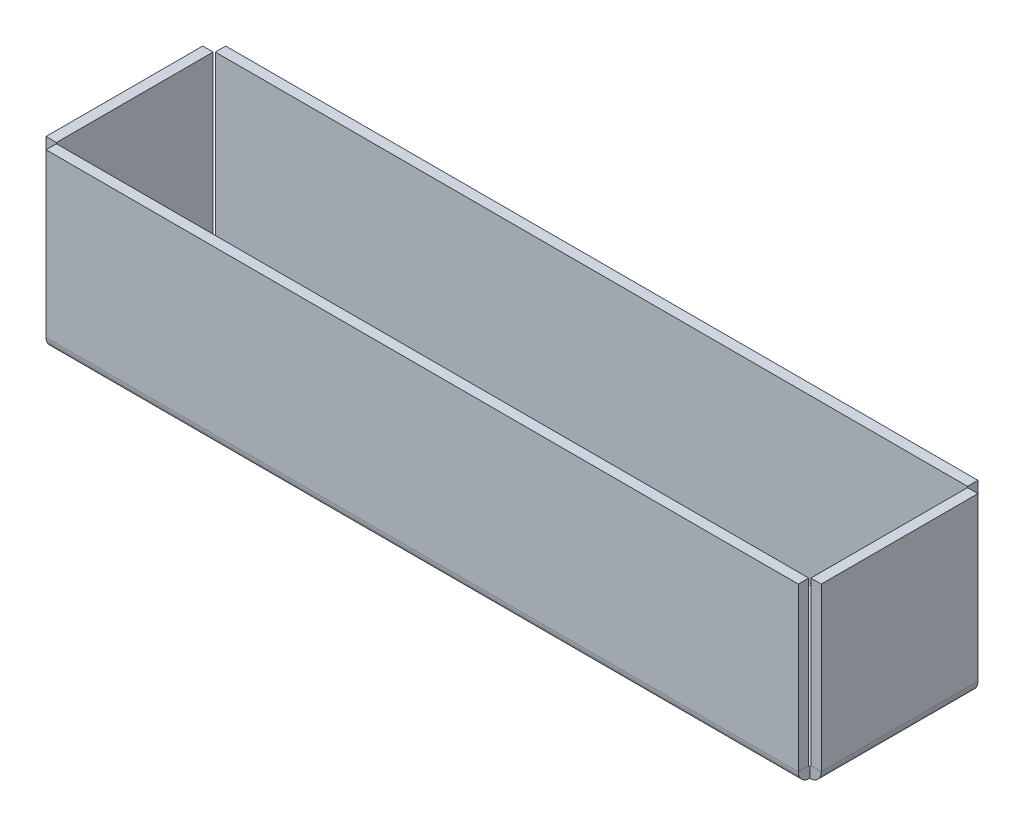
ISO-10303-21;
HEADER;
FILE_DESCRIPTION(('STEP AP214'),'2;1');
FILE_NAME('part.step','',(''),(''),'','','');
FILE_SCHEMA(('AUTOMOTIVE_DESIGN { 1 0 10303 214 1 1 1 1 }'));
ENDSEC;
DATA;
#1=APPLICATION_CONTEXT('core data for automotive mechanical design processes');
#2=APPLICATION_PROTOCOL_DEFINITION('international standard','automotive_design',2000,#1);
#3=PRODUCT_CONTEXT('',#1,'mechanical');
#4=PRODUCT('Part','Part','',(#3));
#5=PRODUCT_RELATED_PRODUCT_CATEGORY('part','',(#4));
#6=PRODUCT_DEFINITION_FORMATION('','',#4);
#7=PRODUCT_DEFINITION_CONTEXT('part definition',#1,'design');
#8=PRODUCT_DEFINITION('design','',#6,#7);
#9=PRODUCT_DEFINITION_SHAPE('','',#8);
#10=(LENGTH_UNIT() NAMED_UNIT(*) SI_UNIT(.MILLI.,.METRE.));
#11=(NAMED_UNIT(*) PLANE_ANGLE_UNIT() SI_UNIT($,.RADIAN.));
#12=(NAMED_UNIT(*) SI_UNIT($,.STERADIAN.) SOLID_ANGLE_UNIT());
#13=UNCERTAINTY_MEASURE_WITH_UNIT(LENGTH_MEASURE(1.E-05),#10,'distance_accuracy_value','');
#14=(GEOMETRIC_REPRESENTATION_CONTEXT(3) GLOBAL_UNCERTAINTY_ASSIGNED_CONTEXT((#13)) GLOBAL_UNIT_ASSIGNED_CONTEXT((#10,
#11,#12)) REPRESENTATION_CONTEXT('',''));
#15=CARTESIAN_POINT('',(0.,0.,0.));
#16=DIRECTION('',(0.,0.,1.));
#17=DIRECTION('',(1.,0.,0.));
#18=AXIS2_PLACEMENT_3D('',#15,#16,#17);
#19=CARTESIAN_POINT('',(0.,0.,0.));
#20=DIRECTION('',(0.,-1.,0.));
#21=DIRECTION('',(0.,0.,-1.));
#22=AXIS2_PLACEMENT_3D('',#19,#20,#21);
#23=PLANE('',#22);
#24=DIRECTION('',(0.,0.,1.));
#25=VECTOR('',#24,1.);
#26=CARTESIAN_POINT('',(36.,0.,0.));
#27=LINE('',#26,#25);
#28=CARTESIAN_POINT('',(36.,0.,-7.5));
#29=VERTEX_POINT('',#28);
#30=CARTESIAN_POINT('',(36.,0.,7.5));
#31=VERTEX_POINT('',#30);
#32=EDGE_CURVE('E375',#29,#31,#27,.T.);
#33=ORIENTED_EDGE('',*,*,#32,.F.);
#34=DIRECTION('',(-1.,0.,0.));
#35=VECTOR('',#34,1.);
#36=CARTESIAN_POINT('',(0.,0.,-7.5));
#37=LINE('',#36,#35);
#38=CARTESIAN_POINT('',(-36.,0.,-7.49999999999999));
#39=VERTEX_POINT('',#38);
#40=EDGE_CURVE('E60',#29,#39,#37,.T.);
#41=ORIENTED_EDGE('',*,*,#40,.T.);
#42=DIRECTION('',(0.,0.,1.));
#43=VECTOR('',#42,1.);
#44=CARTESIAN_POINT('',(-36.,0.,0.));
#45=LINE('',#44,#43);
#46=CARTESIAN_POINT('',(-36.,0.,7.5));
#47=VERTEX_POINT('',#46);
#48=EDGE_CURVE('E336',#39,#47,#45,.T.);
#49=ORIENTED_EDGE('',*,*,#48,.T.);
#50=DIRECTION('',(1.,0.,0.));
#51=VECTOR('',#50,1.);
#52=CARTESIAN_POINT('',(0.,0.,7.5));
#53=LINE('',#52,#51);
#54=EDGE_CURVE('E382',#47,#31,#53,.T.);
#55=ORIENTED_EDGE('',*,*,#54,.T.);
#56=EDGE_LOOP('',(#33,#41,#49,#55));
#57=FACE_BOUND('',#56,.T.);
#58=ADVANCED_FACE('F53',(#57),#23,.F.);
#59=CARTESIAN_POINT('',(0.,-1.,0.));
#60=DIRECTION('',(0.,-1.,0.));
#61=DIRECTION('',(0.,0.,-1.));
#62=AXIS2_PLACEMENT_3D('',#59,#60,#61);
#63=PLANE('',#62);
#64=DIRECTION('',(-1.,0.,0.));
#65=VECTOR('',#64,1.);
#66=CARTESIAN_POINT('',(0.,-1.,-7.5));
#67=LINE('',#66,#65);
#68=CARTESIAN_POINT('',(36.,-1.,-7.5));
#69=VERTEX_POINT('',#68);
#70=CARTESIAN_POINT('',(-36.,-1.,-7.50000000000001));
#71=VERTEX_POINT('',#70);
#72=EDGE_CURVE('E388',#69,#71,#67,.T.);
#73=ORIENTED_EDGE('',*,*,#72,.F.);
#74=DIRECTION('',(0.,0.,1.));
#75=VECTOR('',#74,1.);
#76=CARTESIAN_POINT('',(36.,-1.,0.));
#77=LINE('',#76,#75);
#78=CARTESIAN_POINT('',(36.,-1.,7.5));
#79=VERTEX_POINT('',#78);
#80=EDGE_CURVE('E366',#69,#79,#77,.T.);
#81=ORIENTED_EDGE('',*,*,#80,.T.);
#82=DIRECTION('',(1.,0.,0.));
#83=VECTOR('',#82,1.);
#84=CARTESIAN_POINT('',(0.,-1.,7.5));
#85=LINE('',#84,#83);
#86=CARTESIAN_POINT('',(-36.,-1.,7.5));
#87=VERTEX_POINT('',#86);
#88=EDGE_CURVE('E378',#87,#79,#85,.T.);
#89=ORIENTED_EDGE('',*,*,#88,.F.);
#90=DIRECTION('',(0.,0.,1.));
#91=VECTOR('',#90,1.);
#92=CARTESIAN_POINT('',(-36.,-1.,0.));
#93=LINE('',#92,#91);
#94=EDGE_CURVE('E331',#71,#87,#93,.T.);
#95=ORIENTED_EDGE('',*,*,#94,.F.);
#96=EDGE_LOOP('',(#73,#81,#89,#95));
#97=FACE_BOUND('',#96,.T.);
#98=ADVANCED_FACE('F424',(#97),#63,.T.);
#99=CARTESIAN_POINT('',(-37.1000000000001,-36.8424777960769,0.));
#100=DIRECTION('',(-1.,0.,0.));
#101=DIRECTION('',(0.,0.,-1.));
#102=AXIS2_PLACEMENT_3D('',#99,#100,#101);
#103=PLANE('',#102);
#104=DIRECTION('',(0.,-1.,0.));
#105=VECTOR('',#104,1.);
#106=CARTESIAN_POINT('',(-37.0999999999999,15.6575222039231,-7.5));
#107=LINE('',#106,#105);
#108=CARTESIAN_POINT('',(-37.0999999999999,15.6575222039231,-7.5));
#109=VERTEX_POINT('',#108);
#110=CARTESIAN_POINT('',(-37.1,0.0999999999999992,-7.5));
#111=VERTEX_POINT('',#110);
#112=EDGE_CURVE('E350',#109,#111,#107,.T.);
#113=ORIENTED_EDGE('',*,*,#112,.T.);
#114=DIRECTION('',(0.,0.,1.));
#115=VECTOR('',#114,1.);
#116=CARTESIAN_POINT('',(-37.1,0.100000000000003,0.));
#117=LINE('',#116,#115);
#118=CARTESIAN_POINT('',(-37.1,0.100000000000003,7.5));
#119=VERTEX_POINT('',#118);
#120=EDGE_CURVE('E354',#111,#119,#117,.T.);
#121=ORIENTED_EDGE('',*,*,#120,.T.);
#122=DIRECTION('',(0.,1.,0.));
#123=VECTOR('',#122,1.);
#124=CARTESIAN_POINT('',(-37.0999999999999,15.6575222039231,7.5));
#125=LINE('',#124,#123);
#126=CARTESIAN_POINT('',(-37.0999999999999,15.6575222039231,7.5));
#127=VERTEX_POINT('',#126);
#128=EDGE_CURVE('E346',#119,#127,#125,.T.);
#129=ORIENTED_EDGE('',*,*,#128,.T.);
#130=DIRECTION('',(0.,0.,1.));
#131=VECTOR('',#130,1.);
#132=CARTESIAN_POINT('',(-37.0999999999999,15.6575222039231,24.));
#133=LINE('',#132,#131);
#134=EDGE_CURVE('E351',#109,#127,#133,.T.);
#135=ORIENTED_EDGE('',*,*,#134,.F.);
#136=EDGE_LOOP('',(#113,#121,#129,#135));
#137=FACE_BOUND('',#136,.T.);
#138=ADVANCED_FACE('F430',(#137),#103,.T.);
#139=CARTESIAN_POINT('',(-37.0999999999999,15.6575222039231,24.));
#140=DIRECTION('',(0.,1.,0.));
#141=DIRECTION('',(0.,0.,1.));
#142=AXIS2_PLACEMENT_3D('',#139,#140,#141);
#143=PLANE('',#142);
#144=DIRECTION('',(1.,0.,0.));
#145=VECTOR('',#144,1.);
#146=CARTESIAN_POINT('',(-37.0999999999999,15.6575222039231,7.5));
#147=LINE('',#146,#145);
#148=CARTESIAN_POINT('',(-36.1,15.6575222039231,7.5));
#149=VERTEX_POINT('',#148);
#150=EDGE_CURVE('E342',#127,#149,#147,.T.);
#151=ORIENTED_EDGE('',*,*,#150,.T.);
#152=DIRECTION('',(0.,0.,1.));
#153=VECTOR('',#152,1.);
#154=CARTESIAN_POINT('',(-36.1,15.6575222039231,24.));
#155=LINE('',#154,#153);
#156=CARTESIAN_POINT('',(-36.1,15.6575222039231,-7.5));
#157=VERTEX_POINT('',#156);
#158=EDGE_CURVE('E349',#157,#149,#155,.T.);
#159=ORIENTED_EDGE('',*,*,#158,.F.);
#160=DIRECTION('',(1.,0.,0.));
#161=VECTOR('',#160,1.);
#162=CARTESIAN_POINT('',(-37.0999999999999,15.6575222039231,-7.5));
#163=LINE('',#162,#161);
#164=EDGE_CURVE('E347',#109,#157,#163,.T.);
#165=ORIENTED_EDGE('',*,*,#164,.F.);
#166=ORIENTED_EDGE('',*,*,#134,.T.);
#167=EDGE_LOOP('',(#151,#159,#165,#166));
#168=FACE_BOUND('',#167,.T.);
#169=ADVANCED_FACE('F444',(#168),#143,.T.);
#170=CARTESIAN_POINT('',(-36.1000000000001,-36.8424777960769,0.));
#171=DIRECTION('',(-1.,0.,0.));
#172=DIRECTION('',(0.,0.,-1.));
#173=AXIS2_PLACEMENT_3D('',#170,#171,#172);
#174=PLANE('',#173);
#175=DIRECTION('',(0.,0.,1.));
#176=VECTOR('',#175,1.);
#177=CARTESIAN_POINT('',(-36.1,0.0999999999999959,0.));
#178=LINE('',#177,#176);
#179=CARTESIAN_POINT('',(-36.1,0.1,-7.5));
#180=VERTEX_POINT('',#179);
#181=CARTESIAN_POINT('',(-36.1,0.1,7.5));
#182=VERTEX_POINT('',#181);
#183=EDGE_CURVE('E361',#180,#182,#178,.T.);
#184=ORIENTED_EDGE('',*,*,#183,.F.);
#185=DIRECTION('',(0.,-1.,0.));
#186=VECTOR('',#185,1.);
#187=CARTESIAN_POINT('',(-36.1,15.6575222039231,-7.5));
#188=LINE('',#187,#186);
#189=EDGE_CURVE('E345',#157,#180,#188,.T.);
#190=ORIENTED_EDGE('',*,*,#189,.F.);
#191=ORIENTED_EDGE('',*,*,#158,.T.);
#192=DIRECTION('',(0.,1.,0.));
#193=VECTOR('',#192,1.);
#194=CARTESIAN_POINT('',(-36.1,15.6575222039231,7.5));
#195=LINE('',#194,#193);
#196=EDGE_CURVE('E339',#182,#149,#195,.T.);
#197=ORIENTED_EDGE('',*,*,#196,.F.);
#198=EDGE_LOOP('',(#184,#190,#191,#197));
#199=FACE_BOUND('',#198,.T.);
#200=ADVANCED_FACE('F438',(#199),#174,.F.);
#201=CARTESIAN_POINT('',(-37.0999999999999,15.6575222039231,-7.5));
#202=DIRECTION('',(0.,0.,1.));
#203=DIRECTION('',(0.,-1.,0.));
#204=AXIS2_PLACEMENT_3D('',#201,#202,#203);
#205=PLANE('',#204);
#206=DIRECTION('',(1.,0.,0.));
#207=VECTOR('',#206,1.);
#208=CARTESIAN_POINT('',(-37.1,0.100000000000003,-7.5));
#209=LINE('',#208,#207);
#210=EDGE_CURVE('E359',#111,#180,#209,.T.);
#211=ORIENTED_EDGE('',*,*,#210,.F.);
#212=ORIENTED_EDGE('',*,*,#112,.F.);
#213=ORIENTED_EDGE('',*,*,#164,.T.);
#214=ORIENTED_EDGE('',*,*,#189,.T.);
#215=EDGE_LOOP('',(#211,#212,#213,#214));
#216=FACE_BOUND('',#215,.T.);
#217=ADVANCED_FACE('F434',(#216),#205,.F.);
#218=CARTESIAN_POINT('',(-37.0999999999999,15.6575222039231,7.5));
#219=DIRECTION('',(0.,0.,-1.));
#220=DIRECTION('',(0.,1.,0.));
#221=AXIS2_PLACEMENT_3D('',#218,#219,#220);
#222=PLANE('',#221);
#223=DIRECTION('',(-1.,0.,0.));
#224=VECTOR('',#223,1.);
#225=CARTESIAN_POINT('',(-37.1,0.100000000000003,7.5));
#226=LINE('',#225,#224);
#227=EDGE_CURVE('E363',#182,#119,#226,.T.);
#228=ORIENTED_EDGE('',*,*,#227,.F.);
#229=ORIENTED_EDGE('',*,*,#196,.T.);
#230=ORIENTED_EDGE('',*,*,#150,.F.);
#231=ORIENTED_EDGE('',*,*,#128,.F.);
#232=EDGE_LOOP('',(#228,#229,#230,#231));
#233=FACE_BOUND('',#232,.T.);
#234=ADVANCED_FACE('F442',(#233),#222,.F.);
#235=CARTESIAN_POINT('',(-36.,0.1,-7.5));
#236=DIRECTION('',(0.,0.,-1.));
#237=DIRECTION('',(-1.,0.,0.));
#238=AXIS2_PLACEMENT_3D('',#235,#236,#237);
#239=PLANE('',#238);
#240=ORIENTED_EDGE('',*,*,#210,.T.);
#241=CARTESIAN_POINT('',(-36.,0.1,-7.5));
#242=DIRECTION('',(0.,0.,-1.));
#243=DIRECTION('',(-1.,0.,0.));
#244=AXIS2_PLACEMENT_3D('',#241,#242,#243);
#245=CIRCLE('',#244,0.1);
#246=EDGE_CURVE('E320',#180,#39,#245,.F.);
#247=ORIENTED_EDGE('',*,*,#246,.T.);
#248=DIRECTION('',(0.,1.,0.));
#249=VECTOR('',#248,1.);
#250=CARTESIAN_POINT('',(-36.,-1.,-7.5));
#251=LINE('',#250,#249);
#252=EDGE_CURVE('E390',#71,#39,#251,.T.);
#253=ORIENTED_EDGE('',*,*,#252,.F.);
#254=CARTESIAN_POINT('',(-36.,0.1,-7.5));
#255=DIRECTION('',(0.,0.,1.));
#256=DIRECTION('',(1.,0.,0.));
#257=AXIS2_PLACEMENT_3D('',#254,#255,#256);
#258=CIRCLE('',#257,1.1);
#259=EDGE_CURVE('E325',#111,#71,#258,.T.);
#260=ORIENTED_EDGE('',*,*,#259,.F.);
#261=EDGE_LOOP('',(#240,#247,#253,#260));
#262=FACE_BOUND('',#261,.T.);
#263=ADVANCED_FACE('F404',(#262),#239,.T.);
#264=CARTESIAN_POINT('',(-36.,0.1,7.5));
#265=DIRECTION('',(0.,0.,1.));
#266=DIRECTION('',(1.,0.,0.));
#267=AXIS2_PLACEMENT_3D('',#264,#265,#266);
#268=PLANE('',#267);
#269=CARTESIAN_POINT('',(-36.,0.1,7.5));
#270=DIRECTION('',(0.,0.,-1.));
#271=DIRECTION('',(-1.,0.,0.));
#272=AXIS2_PLACEMENT_3D('',#269,#270,#271);
#273=CIRCLE('',#272,0.1);
#274=EDGE_CURVE('E329',#47,#182,#273,.T.);
#275=ORIENTED_EDGE('',*,*,#274,.T.);
#276=ORIENTED_EDGE('',*,*,#227,.T.);
#277=CARTESIAN_POINT('',(-36.,0.1,7.5));
#278=DIRECTION('',(0.,0.,-1.));
#279=DIRECTION('',(-1.,0.,0.));
#280=AXIS2_PLACEMENT_3D('',#277,#278,#279);
#281=CIRCLE('',#280,1.1);
#282=EDGE_CURVE('E328',#87,#119,#281,.T.);
#283=ORIENTED_EDGE('',*,*,#282,.F.);
#284=DIRECTION('',(0.,1.,0.));
#285=VECTOR('',#284,1.);
#286=CARTESIAN_POINT('',(-36.,-1.,7.5));
#287=LINE('',#286,#285);
#288=EDGE_CURVE('E385',#87,#47,#287,.T.);
#289=ORIENTED_EDGE('',*,*,#288,.T.);
#290=EDGE_LOOP('',(#275,#276,#283,#289));
#291=FACE_BOUND('',#290,.T.);
#292=ADVANCED_FACE('F413',(#291),#268,.T.);
#293=CARTESIAN_POINT('',(-36.,0.1,15.0628106406506));
#294=DIRECTION('',(0.,0.,-1.));
#295=DIRECTION('',(-1.,0.,0.));
#296=AXIS2_PLACEMENT_3D('',#293,#294,#295);
#297=CYLINDRICAL_SURFACE('',#296,1.1);
#298=ORIENTED_EDGE('',*,*,#94,.T.);
#299=ORIENTED_EDGE('',*,*,#282,.T.);
#300=ORIENTED_EDGE('',*,*,#120,.F.);
#301=ORIENTED_EDGE('',*,*,#259,.T.);
#302=EDGE_LOOP('',(#298,#299,#300,#301));
#303=FACE_BOUND('',#302,.T.);
#304=ADVANCED_FACE('F427',(#303),#297,.T.);
#305=CARTESIAN_POINT('',(-36.,0.1,15.0628106406506));
#306=DIRECTION('',(0.,0.,-1.));
#307=DIRECTION('',(-1.,0.,0.));
#308=AXIS2_PLACEMENT_3D('',#305,#306,#307);
#309=CYLINDRICAL_SURFACE('',#308,0.1);
#310=ORIENTED_EDGE('',*,*,#48,.F.);
#311=ORIENTED_EDGE('',*,*,#246,.F.);
#312=ORIENTED_EDGE('',*,*,#183,.T.);
#313=ORIENTED_EDGE('',*,*,#274,.F.);
#314=EDGE_LOOP('',(#310,#311,#312,#313));
#315=FACE_BOUND('',#314,.T.);
#316=ADVANCED_FACE('F408',(#315),#309,.F.);
#317=CARTESIAN_POINT('',(36.,0.1,-7.5));
#318=DIRECTION('',(0.,0.,-1.));
#319=DIRECTION('',(-1.,0.,0.));
#320=AXIS2_PLACEMENT_3D('',#317,#318,#319);
#321=PLANE('',#320);
#322=DIRECTION('',(0.,1.,0.));
#323=VECTOR('',#322,1.);
#324=CARTESIAN_POINT('',(36.,-1.,-7.5));
#325=LINE('',#324,#323);
#326=EDGE_CURVE('E12',#69,#29,#325,.T.);
#327=ORIENTED_EDGE('',*,*,#326,.T.);
#328=CARTESIAN_POINT('',(36.,0.1,-7.5));
#329=DIRECTION('',(0.,0.,1.));
#330=DIRECTION('',(1.,0.,0.));
#331=AXIS2_PLACEMENT_3D('',#328,#329,#330);
#332=CIRCLE('',#331,0.1);
#333=CARTESIAN_POINT('',(36.1,0.0999999999999959,-7.5));
#334=VERTEX_POINT('',#333);
#335=EDGE_CURVE('E284',#29,#334,#332,.T.);
#336=ORIENTED_EDGE('',*,*,#335,.T.);
#337=DIRECTION('',(-1.,0.,0.));
#338=VECTOR('',#337,1.);
#339=CARTESIAN_POINT('',(37.1,0.100000000000003,-7.5));
#340=LINE('',#339,#338);
#341=CARTESIAN_POINT('',(37.1,0.100000000000003,-7.5));
#342=VERTEX_POINT('',#341);
#343=EDGE_CURVE('E297',#342,#334,#340,.T.);
#344=ORIENTED_EDGE('',*,*,#343,.F.);
#345=CARTESIAN_POINT('',(36.,0.1,-7.5));
#346=DIRECTION('',(0.,0.,1.));
#347=DIRECTION('',(1.,0.,0.));
#348=AXIS2_PLACEMENT_3D('',#345,#346,#347);
#349=CIRCLE('',#348,1.1);
#350=EDGE_CURVE('E313',#69,#342,#349,.T.);
#351=ORIENTED_EDGE('',*,*,#350,.F.);
#352=EDGE_LOOP('',(#327,#336,#344,#351));
#353=FACE_BOUND('',#352,.T.);
#354=ADVANCED_FACE('F498',(#353),#321,.T.);
#355=CARTESIAN_POINT('',(36.,0.1,7.5));
#356=DIRECTION('',(0.,0.,1.));
#357=DIRECTION('',(1.,0.,0.));
#358=AXIS2_PLACEMENT_3D('',#355,#356,#357);
#359=PLANE('',#358);
#360=DIRECTION('',(1.,0.,0.));
#361=VECTOR('',#360,1.);
#362=CARTESIAN_POINT('',(37.1,0.100000000000003,7.5));
#363=LINE('',#362,#361);
#364=CARTESIAN_POINT('',(36.1,0.0999999999999959,7.5));
#365=VERTEX_POINT('',#364);
#366=CARTESIAN_POINT('',(37.1,0.0999999999999992,7.5));
#367=VERTEX_POINT('',#366);
#368=EDGE_CURVE('E285',#365,#367,#363,.T.);
#369=ORIENTED_EDGE('',*,*,#368,.F.);
#370=CARTESIAN_POINT('',(36.,0.1,7.5));
#371=DIRECTION('',(0.,0.,1.));
#372=DIRECTION('',(1.,0.,0.));
#373=AXIS2_PLACEMENT_3D('',#370,#371,#372);
#374=CIRCLE('',#373,0.1);
#375=EDGE_CURVE('E317',#365,#31,#374,.F.);
#376=ORIENTED_EDGE('',*,*,#375,.T.);
#377=DIRECTION('',(0.,1.,0.));
#378=VECTOR('',#377,1.);
#379=CARTESIAN_POINT('',(36.,-1.,7.5));
#380=LINE('',#379,#378);
#381=EDGE_CURVE('E380',#79,#31,#380,.T.);
#382=ORIENTED_EDGE('',*,*,#381,.F.);
#383=CARTESIAN_POINT('',(36.,0.1,7.5));
#384=DIRECTION('',(0.,0.,-1.));
#385=DIRECTION('',(-1.,0.,0.));
#386=AXIS2_PLACEMENT_3D('',#383,#384,#385);
#387=CIRCLE('',#386,1.1);
#388=EDGE_CURVE('E316',#367,#79,#387,.T.);
#389=ORIENTED_EDGE('',*,*,#388,.F.);
#390=EDGE_LOOP('',(#369,#376,#382,#389));
#391=FACE_BOUND('',#390,.T.);
#392=ADVANCED_FACE('F505',(#391),#359,.T.);
#393=CARTESIAN_POINT('',(36.,0.1,-15.0628106406506));
#394=DIRECTION('',(0.,0.,1.));
#395=DIRECTION('',(1.,0.,0.));
#396=AXIS2_PLACEMENT_3D('',#393,#394,#395);
#397=CYLINDRICAL_SURFACE('',#396,1.1);
#398=ORIENTED_EDGE('',*,*,#388,.T.);
#399=ORIENTED_EDGE('',*,*,#80,.F.);
#400=ORIENTED_EDGE('',*,*,#350,.T.);
#401=DIRECTION('',(0.,0.,1.));
#402=VECTOR('',#401,1.);
#403=CARTESIAN_POINT('',(37.1,0.100000000000003,0.));
#404=LINE('',#403,#402);
#405=EDGE_CURVE('E278',#342,#367,#404,.T.);
#406=ORIENTED_EDGE('',*,*,#405,.T.);
#407=EDGE_LOOP('',(#398,#399,#400,#406));
#408=FACE_BOUND('',#407,.T.);
#409=ADVANCED_FACE('F513',(#408),#397,.T.);
#410=CARTESIAN_POINT('',(36.,0.1,-15.0628106406506));
#411=DIRECTION('',(0.,0.,1.));
#412=DIRECTION('',(1.,0.,0.));
#413=AXIS2_PLACEMENT_3D('',#410,#411,#412);
#414=CYLINDRICAL_SURFACE('',#413,0.1);
#415=ORIENTED_EDGE('',*,*,#375,.F.);
#416=DIRECTION('',(0.,0.,1.));
#417=VECTOR('',#416,1.);
#418=CARTESIAN_POINT('',(36.1,0.0999999999999959,0.));
#419=LINE('',#418,#417);
#420=EDGE_CURVE('E292',#334,#365,#419,.T.);
#421=ORIENTED_EDGE('',*,*,#420,.F.);
#422=ORIENTED_EDGE('',*,*,#335,.F.);
#423=ORIENTED_EDGE('',*,*,#32,.T.);
#424=EDGE_LOOP('',(#415,#421,#422,#423));
#425=FACE_BOUND('',#424,.T.);
#426=ADVANCED_FACE('F521',(#425),#414,.F.);
#427=CARTESIAN_POINT('',(37.0999999999999,15.6575222039231,24.));
#428=DIRECTION('',(0.,1.,0.));
#429=DIRECTION('',(0.,0.,-1.));
#430=AXIS2_PLACEMENT_3D('',#427,#428,#429);
#431=PLANE('',#430);
#432=DIRECTION('',(-1.,0.,0.));
#433=VECTOR('',#432,1.);
#434=CARTESIAN_POINT('',(37.0999999999999,15.6575222039231,7.5));
#435=LINE('',#434,#433);
#436=CARTESIAN_POINT('',(37.0999999999999,15.6575222039231,7.5));
#437=VERTEX_POINT('',#436);
#438=CARTESIAN_POINT('',(36.0999999999999,15.6575222039231,7.5));
#439=VERTEX_POINT('',#438);
#440=EDGE_CURVE('E282',#437,#439,#435,.T.);
#441=ORIENTED_EDGE('',*,*,#440,.F.);
#442=DIRECTION('',(0.,0.,-1.));
#443=VECTOR('',#442,1.);
#444=CARTESIAN_POINT('',(37.0999999999999,15.6575222039231,24.));
#445=LINE('',#444,#443);
#446=CARTESIAN_POINT('',(37.0999999999999,15.6575222039231,-7.5));
#447=VERTEX_POINT('',#446);
#448=EDGE_CURVE('E308',#437,#447,#445,.T.);
#449=ORIENTED_EDGE('',*,*,#448,.T.);
#450=DIRECTION('',(-1.,0.,0.));
#451=VECTOR('',#450,1.);
#452=CARTESIAN_POINT('',(37.0999999999999,15.6575222039231,-7.5));
#453=LINE('',#452,#451);
#454=CARTESIAN_POINT('',(36.0999999999999,15.6575222039231,-7.5));
#455=VERTEX_POINT('',#454);
#456=EDGE_CURVE('E305',#447,#455,#453,.T.);
#457=ORIENTED_EDGE('',*,*,#456,.T.);
#458=DIRECTION('',(0.,0.,-1.));
#459=VECTOR('',#458,1.);
#460=CARTESIAN_POINT('',(36.0999999999999,15.6575222039231,24.));
#461=LINE('',#460,#459);
#462=EDGE_CURVE('E289',#439,#455,#461,.T.);
#463=ORIENTED_EDGE('',*,*,#462,.F.);
#464=EDGE_LOOP('',(#441,#449,#457,#463));
#465=FACE_BOUND('',#464,.T.);
#466=ADVANCED_FACE('F529',(#465),#431,.T.);
#467=CARTESIAN_POINT('',(37.1000000000001,-36.8424777960769,0.));
#468=DIRECTION('',(1.,0.,0.));
#469=DIRECTION('',(0.,0.,-1.));
#470=AXIS2_PLACEMENT_3D('',#467,#468,#469);
#471=PLANE('',#470);
#472=ORIENTED_EDGE('',*,*,#405,.F.);
#473=DIRECTION('',(0.,1.,0.));
#474=VECTOR('',#473,1.);
#475=CARTESIAN_POINT('',(37.0999999999999,15.6575222039231,-7.5));
#476=LINE('',#475,#474);
#477=EDGE_CURVE('E303',#342,#447,#476,.T.);
#478=ORIENTED_EDGE('',*,*,#477,.T.);
#479=ORIENTED_EDGE('',*,*,#448,.F.);
#480=DIRECTION('',(0.,-1.,0.));
#481=VECTOR('',#480,1.);
#482=CARTESIAN_POINT('',(37.0999999999999,15.6575222039231,7.5));
#483=LINE('',#482,#481);
#484=EDGE_CURVE('E300',#437,#367,#483,.T.);
#485=ORIENTED_EDGE('',*,*,#484,.T.);
#486=EDGE_LOOP('',(#472,#478,#479,#485));
#487=FACE_BOUND('',#486,.T.);
#488=ADVANCED_FACE('F537',(#487),#471,.T.);
#489=CARTESIAN_POINT('',(37.0999999999999,15.6575222039231,-7.5));
#490=DIRECTION('',(0.,0.,1.));
#491=DIRECTION('',(0.,1.,0.));
#492=AXIS2_PLACEMENT_3D('',#489,#490,#491);
#493=PLANE('',#492);
#494=ORIENTED_EDGE('',*,*,#477,.F.);
#495=ORIENTED_EDGE('',*,*,#343,.T.);
#496=DIRECTION('',(0.,1.,0.));
#497=VECTOR('',#496,1.);
#498=CARTESIAN_POINT('',(36.0999999999999,15.6575222039231,-7.5));
#499=LINE('',#498,#497);
#500=EDGE_CURVE('E295',#334,#455,#499,.T.);
#501=ORIENTED_EDGE('',*,*,#500,.T.);
#502=ORIENTED_EDGE('',*,*,#456,.F.);
#503=EDGE_LOOP('',(#494,#495,#501,#502));
#504=FACE_BOUND('',#503,.T.);
#505=ADVANCED_FACE('F545',(#504),#493,.F.);
#506=CARTESIAN_POINT('',(36.1000000000001,-36.8424777960769,0.));
#507=DIRECTION('',(1.,0.,0.));
#508=DIRECTION('',(0.,0.,-1.));
#509=AXIS2_PLACEMENT_3D('',#506,#507,#508);
#510=PLANE('',#509);
#511=ORIENTED_EDGE('',*,*,#500,.F.);
#512=ORIENTED_EDGE('',*,*,#420,.T.);
#513=DIRECTION('',(0.,-1.,0.));
#514=VECTOR('',#513,1.);
#515=CARTESIAN_POINT('',(36.0999999999999,15.6575222039231,7.5));
#516=LINE('',#515,#514);
#517=EDGE_CURVE('E287',#439,#365,#516,.T.);
#518=ORIENTED_EDGE('',*,*,#517,.F.);
#519=ORIENTED_EDGE('',*,*,#462,.T.);
#520=EDGE_LOOP('',(#511,#512,#518,#519));
#521=FACE_BOUND('',#520,.T.);
#522=ADVANCED_FACE('F553',(#521),#510,.F.);
#523=CARTESIAN_POINT('',(37.0999999999999,15.6575222039231,7.5));
#524=DIRECTION('',(0.,0.,-1.));
#525=DIRECTION('',(0.,-1.,0.));
#526=AXIS2_PLACEMENT_3D('',#523,#524,#525);
#527=PLANE('',#526);
#528=ORIENTED_EDGE('',*,*,#517,.T.);
#529=ORIENTED_EDGE('',*,*,#368,.T.);
#530=ORIENTED_EDGE('',*,*,#484,.F.);
#531=ORIENTED_EDGE('',*,*,#440,.T.);
#532=EDGE_LOOP('',(#528,#529,#530,#531));
#533=FACE_BOUND('',#532,.T.);
#534=ADVANCED_FACE('F561',(#533),#527,.F.);
#535=CARTESIAN_POINT('',(-36.,0.1,7.5));
#536=DIRECTION('',(-1.,0.,0.));
#537=DIRECTION('',(0.,0.,1.));
#538=AXIS2_PLACEMENT_3D('',#535,#536,#537);
#539=PLANE('',#538);
#540=DIRECTION('',(0.,0.,-1.));
#541=VECTOR('',#540,1.);
#542=CARTESIAN_POINT('',(-36.,0.100000000000005,8.6));
#543=LINE('',#542,#541);
#544=CARTESIAN_POINT('',(-36.,0.100000000000006,8.6));
#545=VERTEX_POINT('',#544);
#546=CARTESIAN_POINT('',(-36.,0.100000000000001,7.6));
#547=VERTEX_POINT('',#546);
#548=EDGE_CURVE('E238',#545,#547,#543,.T.);
#549=ORIENTED_EDGE('',*,*,#548,.T.);
#550=CARTESIAN_POINT('',(-36.,0.1,7.5));
#551=DIRECTION('',(-1.,0.,0.));
#552=DIRECTION('',(0.,0.,1.));
#553=AXIS2_PLACEMENT_3D('',#550,#551,#552);
#554=CIRCLE('',#553,0.1);
#555=EDGE_CURVE('E75',#547,#47,#554,.F.);
#556=ORIENTED_EDGE('',*,*,#555,.T.);
#557=ORIENTED_EDGE('',*,*,#288,.F.);
#558=CARTESIAN_POINT('',(-36.,0.1,7.5));
#559=DIRECTION('',(1.,0.,0.));
#560=DIRECTION('',(0.,0.,-1.));
#561=AXIS2_PLACEMENT_3D('',#558,#559,#560);
#562=CIRCLE('',#561,1.1);
#563=EDGE_CURVE('E271',#545,#87,#562,.T.);
#564=ORIENTED_EDGE('',*,*,#563,.F.);
#565=EDGE_LOOP('',(#549,#556,#557,#564));
#566=FACE_BOUND('',#565,.T.);
#567=ADVANCED_FACE('F415',(#566),#539,.T.);
#568=CARTESIAN_POINT('',(36.,0.1,7.5));
#569=DIRECTION('',(1.,0.,0.));
#570=DIRECTION('',(0.,0.,-1.));
#571=AXIS2_PLACEMENT_3D('',#568,#569,#570);
#572=PLANE('',#571);
#573=CARTESIAN_POINT('',(36.,0.1,7.5));
#574=DIRECTION('',(-1.,0.,0.));
#575=DIRECTION('',(0.,0.,1.));
#576=AXIS2_PLACEMENT_3D('',#573,#574,#575);
#577=CIRCLE('',#576,0.1);
#578=CARTESIAN_POINT('',(36.,0.100000000000001,7.6));
#579=VERTEX_POINT('',#578);
#580=EDGE_CURVE('E275',#31,#579,#577,.T.);
#581=ORIENTED_EDGE('',*,*,#580,.T.);
#582=DIRECTION('',(0.,0.,1.));
#583=VECTOR('',#582,1.);
#584=CARTESIAN_POINT('',(36.,0.100000000000005,8.6));
#585=LINE('',#584,#583);
#586=CARTESIAN_POINT('',(36.,0.100000000000005,8.6));
#587=VERTEX_POINT('',#586);
#588=EDGE_CURVE('E264',#579,#587,#585,.T.);
#589=ORIENTED_EDGE('',*,*,#588,.T.);
#590=CARTESIAN_POINT('',(36.,0.1,7.5));
#591=DIRECTION('',(-1.,0.,0.));
#592=DIRECTION('',(0.,0.,1.));
#593=AXIS2_PLACEMENT_3D('',#590,#591,#592);
#594=CIRCLE('',#593,1.1);
#595=EDGE_CURVE('E274',#79,#587,#594,.T.);
#596=ORIENTED_EDGE('',*,*,#595,.F.);
#597=ORIENTED_EDGE('',*,*,#381,.T.);
#598=EDGE_LOOP('',(#581,#589,#596,#597));
#599=FACE_BOUND('',#598,.T.);
#600=ADVANCED_FACE('F574',(#599),#572,.T.);
#601=CARTESIAN_POINT('',(72.0131117533196,0.1,7.5));
#602=DIRECTION('',(-1.,0.,0.));
#603=DIRECTION('',(0.,0.,1.));
#604=AXIS2_PLACEMENT_3D('',#601,#602,#603);
#605=CYLINDRICAL_SURFACE('',#604,1.1);
#606=ORIENTED_EDGE('',*,*,#88,.T.);
#607=ORIENTED_EDGE('',*,*,#595,.T.);
#608=DIRECTION('',(1.,0.,0.));
#609=VECTOR('',#608,1.);
#610=CARTESIAN_POINT('',(0.,0.100000000000005,8.6));
#611=LINE('',#610,#609);
#612=EDGE_CURVE('E253',#545,#587,#611,.T.);
#613=ORIENTED_EDGE('',*,*,#612,.F.);
#614=ORIENTED_EDGE('',*,*,#563,.T.);
#615=EDGE_LOOP('',(#606,#607,#613,#614));
#616=FACE_BOUND('',#615,.T.);
#617=ADVANCED_FACE('F419',(#616),#605,.T.);
#618=CARTESIAN_POINT('',(72.0131117533196,0.1,7.5));
#619=DIRECTION('',(-1.,0.,0.));
#620=DIRECTION('',(0.,0.,1.));
#621=AXIS2_PLACEMENT_3D('',#618,#619,#620);
#622=CYLINDRICAL_SURFACE('',#621,0.1);
#623=ORIENTED_EDGE('',*,*,#54,.F.);
#624=ORIENTED_EDGE('',*,*,#555,.F.);
#625=DIRECTION('',(1.,0.,0.));
#626=VECTOR('',#625,1.);
#627=CARTESIAN_POINT('',(0.,0.100000000000001,7.6));
#628=LINE('',#627,#626);
#629=EDGE_CURVE('E267',#547,#579,#628,.T.);
#630=ORIENTED_EDGE('',*,*,#629,.T.);
#631=ORIENTED_EDGE('',*,*,#580,.F.);
#632=EDGE_LOOP('',(#623,#624,#630,#631));
#633=FACE_BOUND('',#632,.T.);
#634=ADVANCED_FACE('F588',(#633),#622,.F.);
#635=CARTESIAN_POINT('',(-52.5,15.6575222039231,8.59999999999995));
#636=DIRECTION('',(0.,1.,0.));
#637=DIRECTION('',(1.,0.,0.));
#638=AXIS2_PLACEMENT_3D('',#635,#636,#637);
#639=PLANE('',#638);
#640=DIRECTION('',(0.,0.,-1.));
#641=VECTOR('',#640,1.);
#642=CARTESIAN_POINT('',(-36.,15.6575222039231,8.59999999999995));
#643=LINE('',#642,#641);
#644=CARTESIAN_POINT('',(-36.,15.6575222039231,8.59999999999995));
#645=VERTEX_POINT('',#644);
#646=CARTESIAN_POINT('',(-36.,15.6575222039231,7.59999999999995));
#647=VERTEX_POINT('',#646);
#648=EDGE_CURVE('E244',#645,#647,#643,.T.);
#649=ORIENTED_EDGE('',*,*,#648,.F.);
#650=DIRECTION('',(1.,0.,0.));
#651=VECTOR('',#650,1.);
#652=CARTESIAN_POINT('',(-52.5,15.6575222039231,8.59999999999995));
#653=LINE('',#652,#651);
#654=CARTESIAN_POINT('',(36.,15.6575222039231,8.59999999999995));
#655=VERTEX_POINT('',#654);
#656=EDGE_CURVE('E261',#645,#655,#653,.T.);
#657=ORIENTED_EDGE('',*,*,#656,.T.);
#658=DIRECTION('',(0.,0.,-1.));
#659=VECTOR('',#658,1.);
#660=CARTESIAN_POINT('',(36.,15.6575222039231,8.59999999999995));
#661=LINE('',#660,#659);
#662=CARTESIAN_POINT('',(36.,15.6575222039231,7.59999999999995));
#663=VERTEX_POINT('',#662);
#664=EDGE_CURVE('E258',#655,#663,#661,.T.);
#665=ORIENTED_EDGE('',*,*,#664,.T.);
#666=DIRECTION('',(1.,0.,0.));
#667=VECTOR('',#666,1.);
#668=CARTESIAN_POINT('',(-52.5,15.6575222039231,7.59999999999995));
#669=LINE('',#668,#667);
#670=EDGE_CURVE('E246',#647,#663,#669,.T.);
#671=ORIENTED_EDGE('',*,*,#670,.F.);
#672=EDGE_LOOP('',(#649,#657,#665,#671));
#673=FACE_BOUND('',#672,.T.);
#674=ADVANCED_FACE('F595',(#673),#639,.T.);
#675=CARTESIAN_POINT('',(0.,-8.34247779607694,8.60000000000003));
#676=DIRECTION('',(0.,0.,1.));
#677=DIRECTION('',(0.,-1.,0.));
#678=AXIS2_PLACEMENT_3D('',#675,#676,#677);
#679=PLANE('',#678);
#680=DIRECTION('',(0.,-1.,0.));
#681=VECTOR('',#680,1.);
#682=CARTESIAN_POINT('',(-36.,15.6575222039231,8.59999999999995));
#683=LINE('',#682,#681);
#684=EDGE_CURVE('E255',#645,#545,#683,.T.);
#685=ORIENTED_EDGE('',*,*,#684,.T.);
#686=ORIENTED_EDGE('',*,*,#612,.T.);
#687=DIRECTION('',(0.,1.,0.));
#688=VECTOR('',#687,1.);
#689=CARTESIAN_POINT('',(36.,15.6575222039231,8.59999999999995));
#690=LINE('',#689,#688);
#691=EDGE_CURVE('E251',#587,#655,#690,.T.);
#692=ORIENTED_EDGE('',*,*,#691,.T.);
#693=ORIENTED_EDGE('',*,*,#656,.F.);
#694=EDGE_LOOP('',(#685,#686,#692,#693));
#695=FACE_BOUND('',#694,.T.);
#696=ADVANCED_FACE('F603',(#695),#679,.T.);
#697=CARTESIAN_POINT('',(36.,15.6575222039231,8.59999999999995));
#698=DIRECTION('',(-1.,0.,0.));
#699=DIRECTION('',(0.,1.,0.));
#700=AXIS2_PLACEMENT_3D('',#697,#698,#699);
#701=PLANE('',#700);
#702=ORIENTED_EDGE('',*,*,#588,.F.);
#703=DIRECTION('',(0.,1.,0.));
#704=VECTOR('',#703,1.);
#705=CARTESIAN_POINT('',(36.,15.6575222039231,7.59999999999995));
#706=LINE('',#705,#704);
#707=EDGE_CURVE('E249',#579,#663,#706,.T.);
#708=ORIENTED_EDGE('',*,*,#707,.T.);
#709=ORIENTED_EDGE('',*,*,#664,.F.);
#710=ORIENTED_EDGE('',*,*,#691,.F.);
#711=EDGE_LOOP('',(#702,#708,#709,#710));
#712=FACE_BOUND('',#711,.T.);
#713=ADVANCED_FACE('F611',(#712),#701,.F.);
#714=CARTESIAN_POINT('',(0.,-8.34247779607694,7.60000000000003));
#715=DIRECTION('',(0.,0.,1.));
#716=DIRECTION('',(0.,-1.,0.));
#717=AXIS2_PLACEMENT_3D('',#714,#715,#716);
#718=PLANE('',#717);
#719=ORIENTED_EDGE('',*,*,#629,.F.);
#720=DIRECTION('',(0.,-1.,0.));
#721=VECTOR('',#720,1.);
#722=CARTESIAN_POINT('',(-36.,15.6575222039231,7.59999999999995));
#723=LINE('',#722,#721);
#724=EDGE_CURVE('E242',#647,#547,#723,.T.);
#725=ORIENTED_EDGE('',*,*,#724,.F.);
#726=ORIENTED_EDGE('',*,*,#670,.T.);
#727=ORIENTED_EDGE('',*,*,#707,.F.);
#728=EDGE_LOOP('',(#719,#725,#726,#727));
#729=FACE_BOUND('',#728,.T.);
#730=ADVANCED_FACE('F619',(#729),#718,.F.);
#731=CARTESIAN_POINT('',(-36.,15.6575222039231,8.59999999999995));
#732=DIRECTION('',(1.,0.,0.));
#733=DIRECTION('',(0.,-1.,0.));
#734=AXIS2_PLACEMENT_3D('',#731,#732,#733);
#735=PLANE('',#734);
#736=ORIENTED_EDGE('',*,*,#548,.F.);
#737=ORIENTED_EDGE('',*,*,#684,.F.);
#738=ORIENTED_EDGE('',*,*,#648,.T.);
#739=ORIENTED_EDGE('',*,*,#724,.T.);
#740=EDGE_LOOP('',(#736,#737,#738,#739));
#741=FACE_BOUND('',#740,.T.);
#742=ADVANCED_FACE('F627',(#741),#735,.F.);
#743=CARTESIAN_POINT('',(36.,0.1,-7.5));
#744=DIRECTION('',(1.,0.,0.));
#745=DIRECTION('',(0.,0.,-1.));
#746=AXIS2_PLACEMENT_3D('',#743,#744,#745);
#747=PLANE('',#746);
#748=DIRECTION('',(0.,0.,1.));
#749=VECTOR('',#748,1.);
#750=CARTESIAN_POINT('',(36.,0.100000000000005,-8.6));
#751=LINE('',#750,#749);
#752=CARTESIAN_POINT('',(36.,0.100000000000009,-8.6));
#753=VERTEX_POINT('',#752);
#754=CARTESIAN_POINT('',(36.,0.100000000000001,-7.6));
#755=VERTEX_POINT('',#754);
#756=EDGE_CURVE('E229',#753,#755,#751,.T.);
#757=ORIENTED_EDGE('',*,*,#756,.T.);
#758=CARTESIAN_POINT('',(35.9999999999999,0.1,-7.5));
#759=DIRECTION('',(1.,0.,0.));
#760=DIRECTION('',(0.,0.,-1.));
#761=AXIS2_PLACEMENT_3D('',#758,#759,#760);
#762=CIRCLE('',#761,0.1);
#763=EDGE_CURVE('E67',#755,#29,#762,.F.);
#764=ORIENTED_EDGE('',*,*,#763,.T.);
#765=ORIENTED_EDGE('',*,*,#326,.F.);
#766=CARTESIAN_POINT('',(36.,0.1,-7.5));
#767=DIRECTION('',(-1.,0.,0.));
#768=DIRECTION('',(0.,0.,1.));
#769=AXIS2_PLACEMENT_3D('',#766,#767,#768);
#770=CIRCLE('',#769,1.1);
#771=EDGE_CURVE('E231',#753,#69,#770,.T.);
#772=ORIENTED_EDGE('',*,*,#771,.F.);
#773=EDGE_LOOP('',(#757,#764,#765,#772));
#774=FACE_BOUND('',#773,.T.);
#775=ADVANCED_FACE('F635',(#774),#747,.T.);
#776=CARTESIAN_POINT('',(-36.,0.1,-7.49999999999999));
#777=DIRECTION('',(-1.,0.,0.));
#778=DIRECTION('',(0.,0.,1.));
#779=AXIS2_PLACEMENT_3D('',#776,#777,#778);
#780=PLANE('',#779);
#781=CARTESIAN_POINT('',(-36.,0.1,-7.49999999999999));
#782=DIRECTION('',(1.,0.,0.));
#783=DIRECTION('',(0.,0.,-1.));
#784=AXIS2_PLACEMENT_3D('',#781,#782,#783);
#785=CIRCLE('',#784,0.1);
#786=CARTESIAN_POINT('',(-36.,0.0999999999999994,-7.59999999999999));
#787=VERTEX_POINT('',#786);
#788=EDGE_CURVE('E235',#39,#787,#785,.T.);
#789=ORIENTED_EDGE('',*,*,#788,.T.);
#790=DIRECTION('',(0.,0.,-1.));
#791=VECTOR('',#790,1.);
#792=CARTESIAN_POINT('',(-36.,0.100000000000003,-8.59999999999999));
#793=LINE('',#792,#791);
#794=CARTESIAN_POINT('',(-36.,0.100000000000003,-8.59999999999999));
#795=VERTEX_POINT('',#794);
#796=EDGE_CURVE('E225',#787,#795,#793,.T.);
#797=ORIENTED_EDGE('',*,*,#796,.T.);
#798=CARTESIAN_POINT('',(-36.,0.1,-7.49999999999999));
#799=DIRECTION('',(1.,0.,0.));
#800=DIRECTION('',(0.,0.,-1.));
#801=AXIS2_PLACEMENT_3D('',#798,#799,#800);
#802=CIRCLE('',#801,1.1);
#803=EDGE_CURVE('E234',#71,#795,#802,.T.);
#804=ORIENTED_EDGE('',*,*,#803,.F.);
#805=ORIENTED_EDGE('',*,*,#252,.T.);
#806=EDGE_LOOP('',(#789,#797,#804,#805));
#807=FACE_BOUND('',#806,.T.);
#808=ADVANCED_FACE('F642',(#807),#780,.T.);
#809=CARTESIAN_POINT('',(-72.0131117533196,0.1,-7.49999999999999));
#810=DIRECTION('',(1.,0.,0.));
#811=DIRECTION('',(0.,0.,-1.));
#812=AXIS2_PLACEMENT_3D('',#809,#810,#811);
#813=CYLINDRICAL_SURFACE('',#812,1.1);
#814=ORIENTED_EDGE('',*,*,#72,.T.);
#815=ORIENTED_EDGE('',*,*,#803,.T.);
#816=DIRECTION('',(-1.,0.,0.));
#817=VECTOR('',#816,1.);
#818=CARTESIAN_POINT('',(0.,0.100000000000003,-8.6));
#819=LINE('',#818,#817);
#820=EDGE_CURVE('E219',#753,#795,#819,.T.);
#821=ORIENTED_EDGE('',*,*,#820,.F.);
#822=ORIENTED_EDGE('',*,*,#771,.T.);
#823=EDGE_LOOP('',(#814,#815,#821,#822));
#824=FACE_BOUND('',#823,.T.);
#825=ADVANCED_FACE('F649',(#824),#813,.T.);
#826=CARTESIAN_POINT('',(-72.0131117533196,0.1,-7.49999999999999));
#827=DIRECTION('',(1.,0.,0.));
#828=DIRECTION('',(0.,0.,-1.));
#829=AXIS2_PLACEMENT_3D('',#826,#827,#828);
#830=CYLINDRICAL_SURFACE('',#829,0.1);
#831=ORIENTED_EDGE('',*,*,#40,.F.);
#832=ORIENTED_EDGE('',*,*,#763,.F.);
#833=DIRECTION('',(-1.,0.,0.));
#834=VECTOR('',#833,1.);
#835=CARTESIAN_POINT('',(0.,0.0999999999999994,-7.6));
#836=LINE('',#835,#834);
#837=EDGE_CURVE('E208',#755,#787,#836,.T.);
#838=ORIENTED_EDGE('',*,*,#837,.T.);
#839=ORIENTED_EDGE('',*,*,#788,.F.);
#840=EDGE_LOOP('',(#831,#832,#838,#839));
#841=FACE_BOUND('',#840,.T.);
#842=ADVANCED_FACE('F399',(#841),#830,.F.);
#843=CARTESIAN_POINT('',(-52.5,15.6575222039231,-8.59999999999994));
#844=DIRECTION('',(0.,1.,0.));
#845=DIRECTION('',(-1.,0.,0.));
#846=AXIS2_PLACEMENT_3D('',#843,#844,#845);
#847=PLANE('',#846);
#848=DIRECTION('',(0.,0.,1.));
#849=VECTOR('',#848,1.);
#850=CARTESIAN_POINT('',(36.,15.6575222039231,-8.59999999999995));
#851=LINE('',#850,#849);
#852=CARTESIAN_POINT('',(36.,15.6575222039231,-8.59999999999995));
#853=VERTEX_POINT('',#852);
#854=CARTESIAN_POINT('',(36.,15.6575222039231,-7.59999999999995));
#855=VERTEX_POINT('',#854);
#856=EDGE_CURVE('E190',#853,#855,#851,.T.);
#857=ORIENTED_EDGE('',*,*,#856,.F.);
#858=DIRECTION('',(-1.,0.,0.));
#859=VECTOR('',#858,1.);
#860=CARTESIAN_POINT('',(-52.5,15.6575222039231,-8.59999999999994));
#861=LINE('',#860,#859);
#862=CARTESIAN_POINT('',(-36.,15.6575222039231,-8.59999999999994));
#863=VERTEX_POINT('',#862);
#864=EDGE_CURVE('E223',#853,#863,#861,.T.);
#865=ORIENTED_EDGE('',*,*,#864,.T.);
#866=DIRECTION('',(0.,0.,1.));
#867=VECTOR('',#866,1.);
#868=CARTESIAN_POINT('',(-36.,15.6575222039231,-8.59999999999994));
#869=LINE('',#868,#867);
#870=CARTESIAN_POINT('',(-36.,15.6575222039231,-7.59999999999994));
#871=VERTEX_POINT('',#870);
#872=EDGE_CURVE('E212',#863,#871,#869,.T.);
#873=ORIENTED_EDGE('',*,*,#872,.T.);
#874=DIRECTION('',(-1.,0.,0.));
#875=VECTOR('',#874,1.);
#876=CARTESIAN_POINT('',(-52.5,15.6575222039231,-7.59999999999993));
#877=LINE('',#876,#875);
#878=EDGE_CURVE('E201',#855,#871,#877,.T.);
#879=ORIENTED_EDGE('',*,*,#878,.F.);
#880=EDGE_LOOP('',(#857,#865,#873,#879));
#881=FACE_BOUND('',#880,.T.);
#882=ADVANCED_FACE('F210',(#881),#847,.T.);
#883=CARTESIAN_POINT('',(0.,-8.34247779607693,-8.60000000000002));
#884=DIRECTION('',(0.,0.,-1.));
#885=DIRECTION('',(0.,1.,0.));
#886=AXIS2_PLACEMENT_3D('',#883,#884,#885);
#887=PLANE('',#886);
#888=DIRECTION('',(0.,-1.,0.));
#889=VECTOR('',#888,1.);
#890=CARTESIAN_POINT('',(36.,15.6575222039231,-8.59999999999995));
#891=LINE('',#890,#889);
#892=EDGE_CURVE('E196',#853,#753,#891,.T.);
#893=ORIENTED_EDGE('',*,*,#892,.T.);
#894=ORIENTED_EDGE('',*,*,#820,.T.);
#895=DIRECTION('',(0.,1.,0.));
#896=VECTOR('',#895,1.);
#897=CARTESIAN_POINT('',(-36.,15.6575222039231,-8.59999999999994));
#898=LINE('',#897,#896);
#899=EDGE_CURVE('E215',#795,#863,#898,.T.);
#900=ORIENTED_EDGE('',*,*,#899,.T.);
#901=ORIENTED_EDGE('',*,*,#864,.F.);
#902=EDGE_LOOP('',(#893,#894,#900,#901));
#903=FACE_BOUND('',#902,.T.);
#904=ADVANCED_FACE('F669',(#903),#887,.T.);
#905=CARTESIAN_POINT('',(-36.,15.6575222039231,-8.59999999999994));
#906=DIRECTION('',(1.,0.,0.));
#907=DIRECTION('',(0.,1.,0.));
#908=AXIS2_PLACEMENT_3D('',#905,#906,#907);
#909=PLANE('',#908);
#910=ORIENTED_EDGE('',*,*,#796,.F.);
#911=DIRECTION('',(0.,1.,0.));
#912=VECTOR('',#911,1.);
#913=CARTESIAN_POINT('',(-36.,15.6575222039231,-7.59999999999994));
#914=LINE('',#913,#912);
#915=EDGE_CURVE('E213',#787,#871,#914,.T.);
#916=ORIENTED_EDGE('',*,*,#915,.T.);
#917=ORIENTED_EDGE('',*,*,#872,.F.);
#918=ORIENTED_EDGE('',*,*,#899,.F.);
#919=EDGE_LOOP('',(#910,#916,#917,#918));
#920=FACE_BOUND('',#919,.T.);
#921=ADVANCED_FACE('F676',(#920),#909,.F.);
#922=CARTESIAN_POINT('',(0.,-8.34247779607694,-7.60000000000003));
#923=DIRECTION('',(0.,0.,-1.));
#924=DIRECTION('',(0.,1.,0.));
#925=AXIS2_PLACEMENT_3D('',#922,#923,#924);
#926=PLANE('',#925);
#927=ORIENTED_EDGE('',*,*,#837,.F.);
#928=DIRECTION('',(0.,-1.,0.));
#929=VECTOR('',#928,1.);
#930=CARTESIAN_POINT('',(36.,15.6575222039231,-7.59999999999995));
#931=LINE('',#930,#929);
#932=EDGE_CURVE('E193',#855,#755,#931,.T.);
#933=ORIENTED_EDGE('',*,*,#932,.F.);
#934=ORIENTED_EDGE('',*,*,#878,.T.);
#935=ORIENTED_EDGE('',*,*,#915,.F.);
#936=EDGE_LOOP('',(#927,#933,#934,#935));
#937=FACE_BOUND('',#936,.T.);
#938=ADVANCED_FACE('F205',(#937),#926,.F.);
#939=CARTESIAN_POINT('',(36.,15.6575222039231,-8.59999999999995));
#940=DIRECTION('',(-1.,0.,0.));
#941=DIRECTION('',(0.,-1.,0.));
#942=AXIS2_PLACEMENT_3D('',#939,#940,#941);
#943=PLANE('',#942);
#944=ORIENTED_EDGE('',*,*,#756,.F.);
#945=ORIENTED_EDGE('',*,*,#892,.F.);
#946=ORIENTED_EDGE('',*,*,#856,.T.);
#947=ORIENTED_EDGE('',*,*,#932,.T.);
#948=EDGE_LOOP('',(#944,#945,#946,#947));
#949=FACE_BOUND('',#948,.T.);
#950=ADVANCED_FACE('F192',(#949),#943,.F.);
#951=CLOSED_SHELL('',(#58,#98,#138,#169,#200,#217,#234,#263,#292,#304,#316,#354,#392,#409,#426,
#466,#488,#505,#522,#534,#567,#600,#617,#634,#674,#696,#713,#730,#742,#775,#808,#825,#842,#882,
#904,#921,#938,#950));
#952=MANIFOLD_SOLID_BREP('B2',#951);
#953=ADVANCED_BREP_SHAPE_REPRESENTATION('',(#18,#952),#14);
#954=SHAPE_DEFINITION_REPRESENTATION(#9,#953);
ENDSEC;
END-ISO-10303-21;
